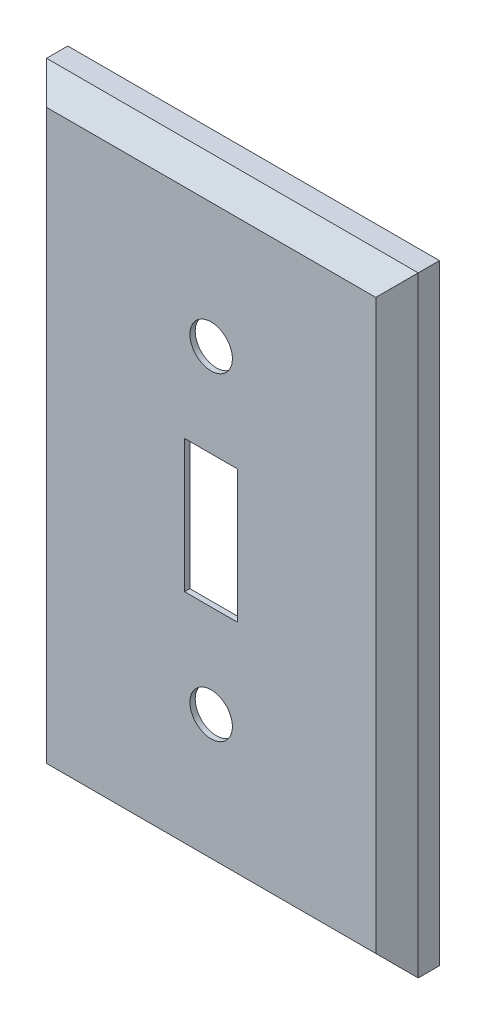
ISO-10303-21;
HEADER;
FILE_DESCRIPTION(('STEP AP214'),'2;1');
FILE_NAME('part.step','',(''),(''),'','','');
FILE_SCHEMA(('AUTOMOTIVE_DESIGN { 1 0 10303 214 1 1 1 1 }'));
ENDSEC;
DATA;
#1=APPLICATION_CONTEXT('core data for automotive mechanical design processes');
#2=APPLICATION_PROTOCOL_DEFINITION('international standard','automotive_design',2000,#1);
#3=PRODUCT_CONTEXT('',#1,'mechanical');
#4=PRODUCT('Part','Part','',(#3));
#5=PRODUCT_RELATED_PRODUCT_CATEGORY('part','',(#4));
#6=PRODUCT_DEFINITION_FORMATION('','',#4);
#7=PRODUCT_DEFINITION_CONTEXT('part definition',#1,'design');
#8=PRODUCT_DEFINITION('design','',#6,#7);
#9=PRODUCT_DEFINITION_SHAPE('','',#8);
#10=(LENGTH_UNIT() NAMED_UNIT(*) SI_UNIT(.MILLI.,.METRE.));
#11=(NAMED_UNIT(*) PLANE_ANGLE_UNIT() SI_UNIT($,.RADIAN.));
#12=(NAMED_UNIT(*) SI_UNIT($,.STERADIAN.) SOLID_ANGLE_UNIT());
#13=UNCERTAINTY_MEASURE_WITH_UNIT(LENGTH_MEASURE(1.E-05),#10,'distance_accuracy_value','');
#14=(GEOMETRIC_REPRESENTATION_CONTEXT(3) GLOBAL_UNCERTAINTY_ASSIGNED_CONTEXT((#13)) GLOBAL_UNIT_ASSIGNED_CONTEXT((#10,
#11,#12)) REPRESENTATION_CONTEXT('',''));
#15=CARTESIAN_POINT('',(0.,0.,0.));
#16=DIRECTION('',(0.,0.,1.));
#17=DIRECTION('',(1.,0.,0.));
#18=AXIS2_PLACEMENT_3D('',#15,#16,#17);
#19=CARTESIAN_POINT('',(0.,0.,0.));
#20=DIRECTION('',(0.,0.,-1.));
#21=DIRECTION('',(-1.,0.,0.));
#22=AXIS2_PLACEMENT_3D('',#19,#20,#21);
#23=PLANE('',#22);
#24=DIRECTION('',(0.,1.,0.));
#25=VECTOR('',#24,1.);
#26=CARTESIAN_POINT('',(35.,-57.5,0.));
#27=LINE('',#26,#25);
#28=CARTESIAN_POINT('',(35.,-57.5,0.));
#29=VERTEX_POINT('',#28);
#30=CARTESIAN_POINT('',(35.,57.5,0.));
#31=VERTEX_POINT('',#30);
#32=EDGE_CURVE('E227',#29,#31,#27,.T.);
#33=ORIENTED_EDGE('',*,*,#32,.F.);
#34=DIRECTION('',(1.,0.,0.));
#35=VECTOR('',#34,1.);
#36=CARTESIAN_POINT('',(-35.,-57.5,0.));
#37=LINE('',#36,#35);
#38=CARTESIAN_POINT('',(-35.,-57.5,0.));
#39=VERTEX_POINT('',#38);
#40=EDGE_CURVE('E237',#39,#29,#37,.T.);
#41=ORIENTED_EDGE('',*,*,#40,.F.);
#42=DIRECTION('',(0.,-1.,0.));
#43=VECTOR('',#42,1.);
#44=CARTESIAN_POINT('',(-35.,-57.5,0.));
#45=LINE('',#44,#43);
#46=CARTESIAN_POINT('',(-35.,57.5,0.));
#47=VERTEX_POINT('',#46);
#48=EDGE_CURVE('E234',#47,#39,#45,.T.);
#49=ORIENTED_EDGE('',*,*,#48,.F.);
#50=DIRECTION('',(-1.,0.,0.));
#51=VECTOR('',#50,1.);
#52=CARTESIAN_POINT('',(-35.,57.5,0.));
#53=LINE('',#52,#51);
#54=EDGE_CURVE('E230',#31,#47,#53,.T.);
#55=ORIENTED_EDGE('',*,*,#54,.F.);
#56=EDGE_LOOP('',(#33,#41,#49,#55));
#57=FACE_BOUND('',#56,.T.);
#58=DIRECTION('',(1.,0.,0.));
#59=VECTOR('',#58,1.);
#60=CARTESIAN_POINT('',(0.,-56.5,0.));
#61=LINE('',#60,#59);
#62=CARTESIAN_POINT('',(-34.,-56.5,0.));
#63=VERTEX_POINT('',#62);
#64=CARTESIAN_POINT('',(34.,-56.5,0.));
#65=VERTEX_POINT('',#64);
#66=EDGE_CURVE('E188',#63,#65,#61,.T.);
#67=ORIENTED_EDGE('',*,*,#66,.T.);
#68=DIRECTION('',(0.,1.,0.));
#69=VECTOR('',#68,1.);
#70=CARTESIAN_POINT('',(34.,0.,0.));
#71=LINE('',#70,#69);
#72=CARTESIAN_POINT('',(34.,56.5,0.));
#73=VERTEX_POINT('',#72);
#74=EDGE_CURVE('E202',#65,#73,#71,.T.);
#75=ORIENTED_EDGE('',*,*,#74,.T.);
#76=DIRECTION('',(-1.,0.,0.));
#77=VECTOR('',#76,1.);
#78=CARTESIAN_POINT('',(0.,56.5,0.));
#79=LINE('',#78,#77);
#80=CARTESIAN_POINT('',(-34.,56.5,0.));
#81=VERTEX_POINT('',#80);
#82=EDGE_CURVE('E219',#73,#81,#79,.T.);
#83=ORIENTED_EDGE('',*,*,#82,.T.);
#84=DIRECTION('',(0.,-1.,0.));
#85=VECTOR('',#84,1.);
#86=CARTESIAN_POINT('',(-34.,0.,0.));
#87=LINE('',#86,#85);
#88=EDGE_CURVE('E222',#81,#63,#87,.T.);
#89=ORIENTED_EDGE('',*,*,#88,.T.);
#90=EDGE_LOOP('',(#67,#75,#83,#89));
#91=FACE_BOUND('',#90,.T.);
#92=ADVANCED_FACE('F34',(#57,#91),#23,.T.);
#93=CARTESIAN_POINT('',(35.,-57.5,8.));
#94=DIRECTION('',(-1.,0.,0.));
#95=DIRECTION('',(0.,0.,1.));
#96=AXIS2_PLACEMENT_3D('',#93,#94,#95);
#97=PLANE('',#96);
#98=DIRECTION('',(0.,0.,-1.));
#99=VECTOR('',#98,1.);
#100=CARTESIAN_POINT('',(35.,57.5,8.));
#101=LINE('',#100,#99);
#102=CARTESIAN_POINT('',(35.,57.5,3.99999999999998));
#103=VERTEX_POINT('',#102);
#104=EDGE_CURVE('E246',#103,#31,#101,.T.);
#105=ORIENTED_EDGE('',*,*,#104,.F.);
#106=DIRECTION('',(0.,-1.,0.));
#107=VECTOR('',#106,1.);
#108=CARTESIAN_POINT('',(35.,-57.5,3.99999999999998));
#109=LINE('',#108,#107);
#110=CARTESIAN_POINT('',(35.,-57.5,3.99999999999998));
#111=VERTEX_POINT('',#110);
#112=EDGE_CURVE('E264',#103,#111,#109,.T.);
#113=ORIENTED_EDGE('',*,*,#112,.T.);
#114=DIRECTION('',(0.,0.,-1.));
#115=VECTOR('',#114,1.);
#116=CARTESIAN_POINT('',(35.,-57.5,8.));
#117=LINE('',#116,#115);
#118=EDGE_CURVE('E240',#111,#29,#117,.T.);
#119=ORIENTED_EDGE('',*,*,#118,.T.);
#120=ORIENTED_EDGE('',*,*,#32,.T.);
#121=EDGE_LOOP('',(#105,#113,#119,#120));
#122=FACE_BOUND('',#121,.T.);
#123=ADVANCED_FACE('F331',(#122),#97,.F.);
#124=CARTESIAN_POINT('',(-35.,57.5,8.));
#125=DIRECTION('',(0.,-1.,0.));
#126=DIRECTION('',(0.,0.,-1.));
#127=AXIS2_PLACEMENT_3D('',#124,#125,#126);
#128=PLANE('',#127);
#129=DIRECTION('',(0.,0.,-1.));
#130=VECTOR('',#129,1.);
#131=CARTESIAN_POINT('',(-35.,57.5,8.));
#132=LINE('',#131,#130);
#133=CARTESIAN_POINT('',(-35.,57.5,3.99999999999998));
#134=VERTEX_POINT('',#133);
#135=EDGE_CURVE('E244',#134,#47,#132,.T.);
#136=ORIENTED_EDGE('',*,*,#135,.F.);
#137=DIRECTION('',(1.,0.,0.));
#138=VECTOR('',#137,1.);
#139=CARTESIAN_POINT('',(-35.,57.5,3.99999999999998));
#140=LINE('',#139,#138);
#141=EDGE_CURVE('E262',#134,#103,#140,.T.);
#142=ORIENTED_EDGE('',*,*,#141,.T.);
#143=ORIENTED_EDGE('',*,*,#104,.T.);
#144=ORIENTED_EDGE('',*,*,#54,.T.);
#145=EDGE_LOOP('',(#136,#142,#143,#144));
#146=FACE_BOUND('',#145,.T.);
#147=ADVANCED_FACE('F337',(#146),#128,.F.);
#148=CARTESIAN_POINT('',(-35.,-57.5,8.));
#149=DIRECTION('',(1.,0.,0.));
#150=DIRECTION('',(0.,0.,-1.));
#151=AXIS2_PLACEMENT_3D('',#148,#149,#150);
#152=PLANE('',#151);
#153=DIRECTION('',(0.,0.,-1.));
#154=VECTOR('',#153,1.);
#155=CARTESIAN_POINT('',(-35.,-57.5,8.));
#156=LINE('',#155,#154);
#157=CARTESIAN_POINT('',(-35.,-57.5,3.99999999999998));
#158=VERTEX_POINT('',#157);
#159=EDGE_CURVE('E242',#158,#39,#156,.T.);
#160=ORIENTED_EDGE('',*,*,#159,.F.);
#161=DIRECTION('',(0.,1.,0.));
#162=VECTOR('',#161,1.);
#163=CARTESIAN_POINT('',(-35.,-57.5,3.99999999999998));
#164=LINE('',#163,#162);
#165=EDGE_CURVE('E260',#158,#134,#164,.T.);
#166=ORIENTED_EDGE('',*,*,#165,.T.);
#167=ORIENTED_EDGE('',*,*,#135,.T.);
#168=ORIENTED_EDGE('',*,*,#48,.T.);
#169=EDGE_LOOP('',(#160,#166,#167,#168));
#170=FACE_BOUND('',#169,.T.);
#171=ADVANCED_FACE('F347',(#170),#152,.F.);
#172=CARTESIAN_POINT('',(-35.,-57.5,8.));
#173=DIRECTION('',(0.,1.,0.));
#174=DIRECTION('',(0.,0.,1.));
#175=AXIS2_PLACEMENT_3D('',#172,#173,#174);
#176=PLANE('',#175);
#177=ORIENTED_EDGE('',*,*,#118,.F.);
#178=DIRECTION('',(-1.,0.,0.));
#179=VECTOR('',#178,1.);
#180=CARTESIAN_POINT('',(-35.,-57.5,3.99999999999998));
#181=LINE('',#180,#179);
#182=EDGE_CURVE('E257',#111,#158,#181,.T.);
#183=ORIENTED_EDGE('',*,*,#182,.T.);
#184=ORIENTED_EDGE('',*,*,#159,.T.);
#185=ORIENTED_EDGE('',*,*,#40,.T.);
#186=EDGE_LOOP('',(#177,#183,#184,#185));
#187=FACE_BOUND('',#186,.T.);
#188=ADVANCED_FACE('F344',(#187),#176,.F.);
#189=CARTESIAN_POINT('',(0.,0.,8.));
#190=DIRECTION('',(0.,0.,-1.));
#191=DIRECTION('',(-1.,0.,0.));
#192=AXIS2_PLACEMENT_3D('',#189,#190,#191);
#193=PLANE('',#192);
#194=CARTESIAN_POINT('',(0.,-30.,8.));
#195=DIRECTION('',(0.,0.,1.));
#196=DIRECTION('',(1.,0.,0.));
#197=AXIS2_PLACEMENT_3D('',#194,#195,#196);
#198=CIRCLE('',#197,4.);
#199=CARTESIAN_POINT('',(4.,-30.,8.));
#200=VERTEX_POINT('',#199);
#201=EDGE_CURVE('E395',#200,#200,#198,.T.);
#202=ORIENTED_EDGE('',*,*,#201,.F.);
#203=EDGE_LOOP('',(#202));
#204=FACE_BOUND('',#203,.T.);
#205=CARTESIAN_POINT('',(0.,30.,8.));
#206=DIRECTION('',(0.,0.,1.));
#207=DIRECTION('',(1.,0.,0.));
#208=AXIS2_PLACEMENT_3D('',#205,#206,#207);
#209=CIRCLE('',#208,4.);
#210=CARTESIAN_POINT('',(4.,30.,8.));
#211=VERTEX_POINT('',#210);
#212=EDGE_CURVE('E398',#211,#211,#209,.T.);
#213=ORIENTED_EDGE('',*,*,#212,.F.);
#214=EDGE_LOOP('',(#213));
#215=FACE_BOUND('',#214,.T.);
#216=DIRECTION('',(-1.,0.,0.));
#217=VECTOR('',#216,1.);
#218=CARTESIAN_POINT('',(-5.,12.5,8.));
#219=LINE('',#218,#217);
#220=CARTESIAN_POINT('',(5.,12.5,8.));
#221=VERTEX_POINT('',#220);
#222=CARTESIAN_POINT('',(-5.,12.5,8.));
#223=VERTEX_POINT('',#222);
#224=EDGE_CURVE('E160',#221,#223,#219,.T.);
#225=ORIENTED_EDGE('',*,*,#224,.F.);
#226=DIRECTION('',(0.,1.,0.));
#227=VECTOR('',#226,1.);
#228=CARTESIAN_POINT('',(5.,-12.5,8.));
#229=LINE('',#228,#227);
#230=CARTESIAN_POINT('',(5.,-12.5,8.));
#231=VERTEX_POINT('',#230);
#232=EDGE_CURVE('E51',#231,#221,#229,.T.);
#233=ORIENTED_EDGE('',*,*,#232,.F.);
#234=DIRECTION('',(1.,0.,0.));
#235=VECTOR('',#234,1.);
#236=CARTESIAN_POINT('',(-5.,-12.5,8.));
#237=LINE('',#236,#235);
#238=CARTESIAN_POINT('',(-5.,-12.5,8.));
#239=VERTEX_POINT('',#238);
#240=EDGE_CURVE('E167',#239,#231,#237,.T.);
#241=ORIENTED_EDGE('',*,*,#240,.F.);
#242=DIRECTION('',(0.,-1.,0.));
#243=VECTOR('',#242,1.);
#244=CARTESIAN_POINT('',(-5.,-12.5,8.));
#245=LINE('',#244,#243);
#246=EDGE_CURVE('E151',#223,#239,#245,.T.);
#247=ORIENTED_EDGE('',*,*,#246,.F.);
#248=EDGE_LOOP('',(#225,#233,#241,#247));
#249=FACE_BOUND('',#248,.T.);
#250=DIRECTION('',(0.,-1.,0.));
#251=VECTOR('',#250,1.);
#252=CARTESIAN_POINT('',(-31.,0.,8.));
#253=LINE('',#252,#251);
#254=CARTESIAN_POINT('',(-31.,53.5,8.));
#255=VERTEX_POINT('',#254);
#256=CARTESIAN_POINT('',(-31.,-53.5,8.));
#257=VERTEX_POINT('',#256);
#258=EDGE_CURVE('E252',#255,#257,#253,.T.);
#259=ORIENTED_EDGE('',*,*,#258,.T.);
#260=DIRECTION('',(1.,0.,0.));
#261=VECTOR('',#260,1.);
#262=CARTESIAN_POINT('',(0.,-53.5,8.));
#263=LINE('',#262,#261);
#264=CARTESIAN_POINT('',(31.,-53.5,8.));
#265=VERTEX_POINT('',#264);
#266=EDGE_CURVE('E254',#257,#265,#263,.T.);
#267=ORIENTED_EDGE('',*,*,#266,.T.);
#268=DIRECTION('',(0.,1.,0.));
#269=VECTOR('',#268,1.);
#270=CARTESIAN_POINT('',(31.,0.,8.));
#271=LINE('',#270,#269);
#272=CARTESIAN_POINT('',(31.,53.5,8.));
#273=VERTEX_POINT('',#272);
#274=EDGE_CURVE('E248',#265,#273,#271,.T.);
#275=ORIENTED_EDGE('',*,*,#274,.T.);
#276=DIRECTION('',(-1.,0.,0.));
#277=VECTOR('',#276,1.);
#278=CARTESIAN_POINT('',(0.,53.5,8.));
#279=LINE('',#278,#277);
#280=EDGE_CURVE('E250',#273,#255,#279,.T.);
#281=ORIENTED_EDGE('',*,*,#280,.T.);
#282=EDGE_LOOP('',(#259,#267,#275,#281));
#283=FACE_BOUND('',#282,.T.);
#284=ADVANCED_FACE('F164',(#204,#215,#249,#283),#193,.F.);
#285=CARTESIAN_POINT('',(0.,53.5,8.));
#286=DIRECTION('',(0.,-0.707106781186549,-0.707106781186546));
#287=DIRECTION('',(-1.,0.,0.));
#288=AXIS2_PLACEMENT_3D('',#285,#286,#287);
#289=PLANE('',#288);
#290=DIRECTION('',(-0.577350269189625,-0.577350269189625,0.577350269189627));
#291=VECTOR('',#290,1.);
#292=CARTESIAN_POINT('',(13.1666666666667,35.6666666666667,25.8333333333334));
#293=LINE('',#292,#291);
#294=EDGE_CURVE('E270',#103,#273,#293,.T.);
#295=ORIENTED_EDGE('',*,*,#294,.F.);
#296=ORIENTED_EDGE('',*,*,#141,.F.);
#297=DIRECTION('',(0.577350269189625,-0.577350269189625,0.577350269189627));
#298=VECTOR('',#297,1.);
#299=CARTESIAN_POINT('',(-20.6666666666667,43.1666666666667,18.3333333333333));
#300=LINE('',#299,#298);
#301=EDGE_CURVE('E231',#255,#134,#300,.F.);
#302=ORIENTED_EDGE('',*,*,#301,.F.);
#303=ORIENTED_EDGE('',*,*,#280,.F.);
#304=EDGE_LOOP('',(#295,#296,#302,#303));
#305=FACE_BOUND('',#304,.T.);
#306=ADVANCED_FACE('F36',(#305),#289,.F.);
#307=CARTESIAN_POINT('',(-31.,0.,8.));
#308=DIRECTION('',(0.707106781186549,0.,-0.707106781186546));
#309=DIRECTION('',(0.,-1.,0.));
#310=AXIS2_PLACEMENT_3D('',#307,#308,#309);
#311=PLANE('',#310);
#312=ORIENTED_EDGE('',*,*,#301,.T.);
#313=ORIENTED_EDGE('',*,*,#165,.F.);
#314=DIRECTION('',(0.577350269189625,0.577350269189625,0.577350269189627));
#315=VECTOR('',#314,1.);
#316=CARTESIAN_POINT('',(-13.1666666666667,-35.6666666666667,25.8333333333333));
#317=LINE('',#316,#315);
#318=EDGE_CURVE('E268',#257,#158,#317,.F.);
#319=ORIENTED_EDGE('',*,*,#318,.F.);
#320=ORIENTED_EDGE('',*,*,#258,.F.);
#321=EDGE_LOOP('',(#312,#313,#319,#320));
#322=FACE_BOUND('',#321,.T.);
#323=ADVANCED_FACE('F361',(#322),#311,.F.);
#324=CARTESIAN_POINT('',(31.,0.,8.));
#325=DIRECTION('',(-0.707106781186549,0.,-0.707106781186546));
#326=DIRECTION('',(0.,1.,0.));
#327=AXIS2_PLACEMENT_3D('',#324,#325,#326);
#328=PLANE('',#327);
#329=ORIENTED_EDGE('',*,*,#294,.T.);
#330=ORIENTED_EDGE('',*,*,#274,.F.);
#331=DIRECTION('',(0.577350269189625,-0.577350269189625,-0.577350269189627));
#332=VECTOR('',#331,1.);
#333=CARTESIAN_POINT('',(13.1666666666667,-35.6666666666667,25.8333333333333));
#334=LINE('',#333,#332);
#335=EDGE_CURVE('E183',#111,#265,#334,.F.);
#336=ORIENTED_EDGE('',*,*,#335,.F.);
#337=ORIENTED_EDGE('',*,*,#112,.F.);
#338=EDGE_LOOP('',(#329,#330,#336,#337));
#339=FACE_BOUND('',#338,.T.);
#340=ADVANCED_FACE('F358',(#339),#328,.F.);
#341=CARTESIAN_POINT('',(0.,-53.5,8.));
#342=DIRECTION('',(0.,0.707106781186549,-0.707106781186546));
#343=DIRECTION('',(1.,0.,0.));
#344=AXIS2_PLACEMENT_3D('',#341,#342,#343);
#345=PLANE('',#344);
#346=ORIENTED_EDGE('',*,*,#318,.T.);
#347=ORIENTED_EDGE('',*,*,#182,.F.);
#348=ORIENTED_EDGE('',*,*,#335,.T.);
#349=ORIENTED_EDGE('',*,*,#266,.F.);
#350=EDGE_LOOP('',(#346,#347,#348,#349));
#351=FACE_BOUND('',#350,.T.);
#352=ADVANCED_FACE('F355',(#351),#345,.F.);
#353=CARTESIAN_POINT('',(34.,-57.5,8.));
#354=DIRECTION('',(-1.,0.,0.));
#355=DIRECTION('',(0.,0.,1.));
#356=AXIS2_PLACEMENT_3D('',#353,#354,#355);
#357=PLANE('',#356);
#358=DIRECTION('',(0.,0.,-1.));
#359=VECTOR('',#358,1.);
#360=CARTESIAN_POINT('',(34.,56.5,8.));
#361=LINE('',#360,#359);
#362=CARTESIAN_POINT('',(34.,56.5,3.58578643762689));
#363=VERTEX_POINT('',#362);
#364=EDGE_CURVE('E177',#363,#73,#361,.T.);
#365=ORIENTED_EDGE('',*,*,#364,.T.);
#366=ORIENTED_EDGE('',*,*,#74,.F.);
#367=DIRECTION('',(0.,0.,-1.));
#368=VECTOR('',#367,1.);
#369=CARTESIAN_POINT('',(34.,-56.5,8.));
#370=LINE('',#369,#368);
#371=CARTESIAN_POINT('',(34.,-56.5,3.58578643762689));
#372=VERTEX_POINT('',#371);
#373=EDGE_CURVE('E185',#372,#65,#370,.T.);
#374=ORIENTED_EDGE('',*,*,#373,.F.);
#375=DIRECTION('',(0.,1.,0.));
#376=VECTOR('',#375,1.);
#377=CARTESIAN_POINT('',(34.,0.,3.58578643762689));
#378=LINE('',#377,#376);
#379=EDGE_CURVE('E181',#363,#372,#378,.F.);
#380=ORIENTED_EDGE('',*,*,#379,.F.);
#381=EDGE_LOOP('',(#365,#366,#374,#380));
#382=FACE_BOUND('',#381,.T.);
#383=ADVANCED_FACE('F327',(#382),#357,.T.);
#384=CARTESIAN_POINT('',(-35.,56.5,8.));
#385=DIRECTION('',(0.,-1.,0.));
#386=DIRECTION('',(0.,0.,-1.));
#387=AXIS2_PLACEMENT_3D('',#384,#385,#386);
#388=PLANE('',#387);
#389=DIRECTION('',(0.,0.,-1.));
#390=VECTOR('',#389,1.);
#391=CARTESIAN_POINT('',(-34.,56.5,8.));
#392=LINE('',#391,#390);
#393=CARTESIAN_POINT('',(-34.,56.5,3.58578643762689));
#394=VERTEX_POINT('',#393);
#395=EDGE_CURVE('E180',#394,#81,#392,.T.);
#396=ORIENTED_EDGE('',*,*,#395,.T.);
#397=ORIENTED_EDGE('',*,*,#82,.F.);
#398=ORIENTED_EDGE('',*,*,#364,.F.);
#399=DIRECTION('',(-1.,0.,0.));
#400=VECTOR('',#399,1.);
#401=CARTESIAN_POINT('',(0.,56.5,3.58578643762689));
#402=LINE('',#401,#400);
#403=EDGE_CURVE('E184',#394,#363,#402,.F.);
#404=ORIENTED_EDGE('',*,*,#403,.F.);
#405=EDGE_LOOP('',(#396,#397,#398,#404));
#406=FACE_BOUND('',#405,.T.);
#407=ADVANCED_FACE('F319',(#406),#388,.T.);
#408=CARTESIAN_POINT('',(-34.,-57.5,8.));
#409=DIRECTION('',(1.,0.,0.));
#410=DIRECTION('',(0.,0.,-1.));
#411=AXIS2_PLACEMENT_3D('',#408,#409,#410);
#412=PLANE('',#411);
#413=DIRECTION('',(0.,0.,-1.));
#414=VECTOR('',#413,1.);
#415=CARTESIAN_POINT('',(-34.,-56.5,8.));
#416=LINE('',#415,#414);
#417=CARTESIAN_POINT('',(-34.,-56.5,3.58578643762689));
#418=VERTEX_POINT('',#417);
#419=EDGE_CURVE('E187',#418,#63,#416,.T.);
#420=ORIENTED_EDGE('',*,*,#419,.T.);
#421=ORIENTED_EDGE('',*,*,#88,.F.);
#422=ORIENTED_EDGE('',*,*,#395,.F.);
#423=DIRECTION('',(0.,-1.,0.));
#424=VECTOR('',#423,1.);
#425=CARTESIAN_POINT('',(-34.,0.,3.58578643762689));
#426=LINE('',#425,#424);
#427=EDGE_CURVE('E192',#418,#394,#426,.F.);
#428=ORIENTED_EDGE('',*,*,#427,.F.);
#429=EDGE_LOOP('',(#420,#421,#422,#428));
#430=FACE_BOUND('',#429,.T.);
#431=ADVANCED_FACE('F313',(#430),#412,.T.);
#432=CARTESIAN_POINT('',(-35.,-56.5,8.));
#433=DIRECTION('',(0.,1.,0.));
#434=DIRECTION('',(0.,0.,1.));
#435=AXIS2_PLACEMENT_3D('',#432,#433,#434);
#436=PLANE('',#435);
#437=ORIENTED_EDGE('',*,*,#373,.T.);
#438=ORIENTED_EDGE('',*,*,#66,.F.);
#439=ORIENTED_EDGE('',*,*,#419,.F.);
#440=DIRECTION('',(1.,0.,0.));
#441=VECTOR('',#440,1.);
#442=CARTESIAN_POINT('',(0.,-56.5,3.58578643762689));
#443=LINE('',#442,#441);
#444=EDGE_CURVE('E195',#372,#418,#443,.F.);
#445=ORIENTED_EDGE('',*,*,#444,.F.);
#446=EDGE_LOOP('',(#437,#438,#439,#445));
#447=FACE_BOUND('',#446,.T.);
#448=ADVANCED_FACE('F290',(#447),#436,.T.);
#449=CARTESIAN_POINT('',(0.,0.,7.));
#450=DIRECTION('',(0.,0.,-1.));
#451=DIRECTION('',(-1.,0.,0.));
#452=AXIS2_PLACEMENT_3D('',#449,#450,#451);
#453=PLANE('',#452);
#454=CARTESIAN_POINT('',(0.,-30.,7.));
#455=DIRECTION('',(0.,0.,-1.));
#456=DIRECTION('',(-1.,0.,0.));
#457=AXIS2_PLACEMENT_3D('',#454,#455,#456);
#458=CIRCLE('',#457,4.);
#459=CARTESIAN_POINT('',(-4.,-30.,7.));
#460=VERTEX_POINT('',#459);
#461=EDGE_CURVE('E38',#460,#460,#458,.T.);
#462=ORIENTED_EDGE('',*,*,#461,.F.);
#463=EDGE_LOOP('',(#462));
#464=FACE_BOUND('',#463,.T.);
#465=CARTESIAN_POINT('',(0.,30.,7.));
#466=DIRECTION('',(0.,0.,-1.));
#467=DIRECTION('',(-1.,0.,0.));
#468=AXIS2_PLACEMENT_3D('',#465,#466,#467);
#469=CIRCLE('',#468,4.);
#470=CARTESIAN_POINT('',(-4.,30.,7.));
#471=VERTEX_POINT('',#470);
#472=EDGE_CURVE('E174',#471,#471,#469,.T.);
#473=ORIENTED_EDGE('',*,*,#472,.F.);
#474=EDGE_LOOP('',(#473));
#475=FACE_BOUND('',#474,.T.);
#476=DIRECTION('',(0.,-1.,0.));
#477=VECTOR('',#476,1.);
#478=CARTESIAN_POINT('',(5.,0.,7.));
#479=LINE('',#478,#477);
#480=CARTESIAN_POINT('',(5.,12.5,7.));
#481=VERTEX_POINT('',#480);
#482=CARTESIAN_POINT('',(5.,-12.5,7.));
#483=VERTEX_POINT('',#482);
#484=EDGE_CURVE('E11',#481,#483,#479,.T.);
#485=ORIENTED_EDGE('',*,*,#484,.F.);
#486=DIRECTION('',(1.,0.,0.));
#487=VECTOR('',#486,1.);
#488=CARTESIAN_POINT('',(0.,12.5,7.));
#489=LINE('',#488,#487);
#490=CARTESIAN_POINT('',(-5.,12.5,7.));
#491=VERTEX_POINT('',#490);
#492=EDGE_CURVE('E266',#491,#481,#489,.T.);
#493=ORIENTED_EDGE('',*,*,#492,.F.);
#494=DIRECTION('',(0.,1.,0.));
#495=VECTOR('',#494,1.);
#496=CARTESIAN_POINT('',(-5.,0.,7.));
#497=LINE('',#496,#495);
#498=CARTESIAN_POINT('',(-5.,-12.5,7.));
#499=VERTEX_POINT('',#498);
#500=EDGE_CURVE('E154',#499,#491,#497,.T.);
#501=ORIENTED_EDGE('',*,*,#500,.F.);
#502=DIRECTION('',(-1.,0.,0.));
#503=VECTOR('',#502,1.);
#504=CARTESIAN_POINT('',(0.,-12.5,7.));
#505=LINE('',#504,#503);
#506=EDGE_CURVE('E43',#483,#499,#505,.T.);
#507=ORIENTED_EDGE('',*,*,#506,.F.);
#508=EDGE_LOOP('',(#485,#493,#501,#507));
#509=FACE_BOUND('',#508,.T.);
#510=DIRECTION('',(0.,1.,0.));
#511=VECTOR('',#510,1.);
#512=CARTESIAN_POINT('',(-30.5857864376269,0.,7.));
#513=LINE('',#512,#511);
#514=CARTESIAN_POINT('',(-30.5857864376269,53.0857864376269,7.));
#515=VERTEX_POINT('',#514);
#516=CARTESIAN_POINT('',(-30.5857864376269,-53.0857864376269,7.));
#517=VERTEX_POINT('',#516);
#518=EDGE_CURVE('E207',#515,#517,#513,.F.);
#519=ORIENTED_EDGE('',*,*,#518,.F.);
#520=DIRECTION('',(1.,0.,0.));
#521=VECTOR('',#520,1.);
#522=CARTESIAN_POINT('',(0.,53.0857864376269,7.));
#523=LINE('',#522,#521);
#524=CARTESIAN_POINT('',(30.5857864376269,53.0857864376269,7.));
#525=VERTEX_POINT('',#524);
#526=EDGE_CURVE('E209',#525,#515,#523,.F.);
#527=ORIENTED_EDGE('',*,*,#526,.F.);
#528=DIRECTION('',(0.,-1.,0.));
#529=VECTOR('',#528,1.);
#530=CARTESIAN_POINT('',(30.5857864376269,0.,7.));
#531=LINE('',#530,#529);
#532=CARTESIAN_POINT('',(30.5857864376269,-53.0857864376269,7.));
#533=VERTEX_POINT('',#532);
#534=EDGE_CURVE('E179',#533,#525,#531,.F.);
#535=ORIENTED_EDGE('',*,*,#534,.F.);
#536=DIRECTION('',(-1.,0.,0.));
#537=VECTOR('',#536,1.);
#538=CARTESIAN_POINT('',(0.,-53.0857864376269,7.));
#539=LINE('',#538,#537);
#540=EDGE_CURVE('E198',#517,#533,#539,.F.);
#541=ORIENTED_EDGE('',*,*,#540,.F.);
#542=EDGE_LOOP('',(#519,#527,#535,#541));
#543=FACE_BOUND('',#542,.T.);
#544=ADVANCED_FACE('F286',(#464,#475,#509,#543),#453,.T.);
#545=CARTESIAN_POINT('',(0.,52.7928932188135,7.29289321881345));
#546=DIRECTION('',(0.,-0.707106781186549,-0.707106781186546));
#547=DIRECTION('',(-1.,0.,0.));
#548=AXIS2_PLACEMENT_3D('',#545,#546,#547);
#549=PLANE('',#548);
#550=DIRECTION('',(-0.577350269189625,-0.577350269189625,0.577350269189627));
#551=VECTOR('',#550,1.);
#552=CARTESIAN_POINT('',(12.6952621458757,35.1952621458757,24.8905242917513));
#553=LINE('',#552,#551);
#554=EDGE_CURVE('E203',#363,#525,#553,.T.);
#555=ORIENTED_EDGE('',*,*,#554,.T.);
#556=ORIENTED_EDGE('',*,*,#526,.T.);
#557=DIRECTION('',(-0.577350269189625,0.577350269189625,-0.577350269189627));
#558=VECTOR('',#557,1.);
#559=CARTESIAN_POINT('',(-12.6952621458757,35.1952621458757,24.8905242917513));
#560=LINE('',#559,#558);
#561=EDGE_CURVE('E199',#515,#394,#560,.T.);
#562=ORIENTED_EDGE('',*,*,#561,.T.);
#563=ORIENTED_EDGE('',*,*,#403,.T.);
#564=EDGE_LOOP('',(#555,#556,#562,#563));
#565=FACE_BOUND('',#564,.T.);
#566=ADVANCED_FACE('F289',(#565),#549,.T.);
#567=CARTESIAN_POINT('',(-30.2928932188134,0.,7.29289321881345));
#568=DIRECTION('',(0.707106781186549,0.,-0.707106781186546));
#569=DIRECTION('',(0.,-1.,0.));
#570=AXIS2_PLACEMENT_3D('',#567,#568,#569);
#571=PLANE('',#570);
#572=ORIENTED_EDGE('',*,*,#561,.F.);
#573=ORIENTED_EDGE('',*,*,#518,.T.);
#574=DIRECTION('',(-0.577350269189625,-0.577350269189625,-0.577350269189627));
#575=VECTOR('',#574,1.);
#576=CARTESIAN_POINT('',(-20.1952621458756,-42.6952621458757,17.3905242917513));
#577=LINE('',#576,#575);
#578=EDGE_CURVE('E204',#517,#418,#577,.T.);
#579=ORIENTED_EDGE('',*,*,#578,.T.);
#580=ORIENTED_EDGE('',*,*,#427,.T.);
#581=EDGE_LOOP('',(#572,#573,#579,#580));
#582=FACE_BOUND('',#581,.T.);
#583=ADVANCED_FACE('F303',(#582),#571,.T.);
#584=CARTESIAN_POINT('',(30.2928932188135,0.,7.29289321881345));
#585=DIRECTION('',(-0.707106781186549,0.,-0.707106781186546));
#586=DIRECTION('',(0.,1.,0.));
#587=AXIS2_PLACEMENT_3D('',#584,#585,#586);
#588=PLANE('',#587);
#589=ORIENTED_EDGE('',*,*,#554,.F.);
#590=ORIENTED_EDGE('',*,*,#379,.T.);
#591=DIRECTION('',(-0.577350269189625,0.577350269189625,0.577350269189627));
#592=VECTOR('',#591,1.);
#593=CARTESIAN_POINT('',(20.1952621458757,-42.6952621458756,17.3905242917513));
#594=LINE('',#593,#592);
#595=EDGE_CURVE('E206',#372,#533,#594,.T.);
#596=ORIENTED_EDGE('',*,*,#595,.T.);
#597=ORIENTED_EDGE('',*,*,#534,.T.);
#598=EDGE_LOOP('',(#589,#590,#596,#597));
#599=FACE_BOUND('',#598,.T.);
#600=ADVANCED_FACE('F324',(#599),#588,.T.);
#601=CARTESIAN_POINT('',(0.,-52.7928932188134,7.29289321881345));
#602=DIRECTION('',(0.,0.707106781186549,-0.707106781186546));
#603=DIRECTION('',(1.,0.,0.));
#604=AXIS2_PLACEMENT_3D('',#601,#602,#603);
#605=PLANE('',#604);
#606=ORIENTED_EDGE('',*,*,#578,.F.);
#607=ORIENTED_EDGE('',*,*,#540,.T.);
#608=ORIENTED_EDGE('',*,*,#595,.F.);
#609=ORIENTED_EDGE('',*,*,#444,.T.);
#610=EDGE_LOOP('',(#606,#607,#608,#609));
#611=FACE_BOUND('',#610,.T.);
#612=ADVANCED_FACE('F306',(#611),#605,.T.);
#613=CARTESIAN_POINT('',(5.,-12.5,0.));
#614=DIRECTION('',(1.,0.,0.));
#615=DIRECTION('',(0.,0.,-1.));
#616=AXIS2_PLACEMENT_3D('',#613,#614,#615);
#617=PLANE('',#616);
#618=ORIENTED_EDGE('',*,*,#484,.T.);
#619=DIRECTION('',(0.,0.,1.));
#620=VECTOR('',#619,1.);
#621=CARTESIAN_POINT('',(5.,-12.5,0.));
#622=LINE('',#621,#620);
#623=EDGE_CURVE('E172',#483,#231,#622,.T.);
#624=ORIENTED_EDGE('',*,*,#623,.T.);
#625=ORIENTED_EDGE('',*,*,#232,.T.);
#626=DIRECTION('',(0.,0.,1.));
#627=VECTOR('',#626,1.);
#628=CARTESIAN_POINT('',(5.,12.5,0.));
#629=LINE('',#628,#627);
#630=EDGE_CURVE('E157',#481,#221,#629,.T.);
#631=ORIENTED_EDGE('',*,*,#630,.F.);
#632=EDGE_LOOP('',(#618,#624,#625,#631));
#633=FACE_BOUND('',#632,.T.);
#634=ADVANCED_FACE('F413',(#633),#617,.F.);
#635=CARTESIAN_POINT('',(-5.,-12.5,0.));
#636=DIRECTION('',(0.,-1.,0.));
#637=DIRECTION('',(0.,0.,-1.));
#638=AXIS2_PLACEMENT_3D('',#635,#636,#637);
#639=PLANE('',#638);
#640=ORIENTED_EDGE('',*,*,#506,.T.);
#641=DIRECTION('',(0.,0.,1.));
#642=VECTOR('',#641,1.);
#643=CARTESIAN_POINT('',(-5.,-12.5,0.));
#644=LINE('',#643,#642);
#645=EDGE_CURVE('E156',#499,#239,#644,.T.);
#646=ORIENTED_EDGE('',*,*,#645,.T.);
#647=ORIENTED_EDGE('',*,*,#240,.T.);
#648=ORIENTED_EDGE('',*,*,#623,.F.);
#649=EDGE_LOOP('',(#640,#646,#647,#648));
#650=FACE_BOUND('',#649,.T.);
#651=ADVANCED_FACE('F410',(#650),#639,.F.);
#652=CARTESIAN_POINT('',(-5.,-12.5,0.));
#653=DIRECTION('',(-1.,0.,0.));
#654=DIRECTION('',(0.,0.,1.));
#655=AXIS2_PLACEMENT_3D('',#652,#653,#654);
#656=PLANE('',#655);
#657=ORIENTED_EDGE('',*,*,#500,.T.);
#658=DIRECTION('',(0.,0.,1.));
#659=VECTOR('',#658,1.);
#660=CARTESIAN_POINT('',(-5.,12.5,0.));
#661=LINE('',#660,#659);
#662=EDGE_CURVE('E59',#491,#223,#661,.T.);
#663=ORIENTED_EDGE('',*,*,#662,.T.);
#664=ORIENTED_EDGE('',*,*,#246,.T.);
#665=ORIENTED_EDGE('',*,*,#645,.F.);
#666=EDGE_LOOP('',(#657,#663,#664,#665));
#667=FACE_BOUND('',#666,.T.);
#668=ADVANCED_FACE('F148',(#667),#656,.F.);
#669=CARTESIAN_POINT('',(-5.,12.5,0.));
#670=DIRECTION('',(0.,1.,0.));
#671=DIRECTION('',(0.,0.,1.));
#672=AXIS2_PLACEMENT_3D('',#669,#670,#671);
#673=PLANE('',#672);
#674=ORIENTED_EDGE('',*,*,#492,.T.);
#675=ORIENTED_EDGE('',*,*,#630,.T.);
#676=ORIENTED_EDGE('',*,*,#224,.T.);
#677=ORIENTED_EDGE('',*,*,#662,.F.);
#678=EDGE_LOOP('',(#674,#675,#676,#677));
#679=FACE_BOUND('',#678,.T.);
#680=ADVANCED_FACE('F161',(#679),#673,.F.);
#681=CARTESIAN_POINT('',(0.,30.,0.));
#682=DIRECTION('',(0.,0.,1.));
#683=DIRECTION('',(1.,0.,0.));
#684=AXIS2_PLACEMENT_3D('',#681,#682,#683);
#685=CYLINDRICAL_SURFACE('',#684,4.);
#686=ORIENTED_EDGE('',*,*,#472,.T.);
#687=EDGE_LOOP('',(#686));
#688=FACE_BOUND('',#687,.T.);
#689=ORIENTED_EDGE('',*,*,#212,.T.);
#690=EDGE_LOOP('',(#689));
#691=FACE_BOUND('',#690,.T.);
#692=ADVANCED_FACE('F403',(#688,#691),#685,.F.);
#693=CARTESIAN_POINT('',(0.,-30.,0.));
#694=DIRECTION('',(0.,0.,1.));
#695=DIRECTION('',(1.,0.,0.));
#696=AXIS2_PLACEMENT_3D('',#693,#694,#695);
#697=CYLINDRICAL_SURFACE('',#696,4.);
#698=ORIENTED_EDGE('',*,*,#461,.T.);
#699=EDGE_LOOP('',(#698));
#700=FACE_BOUND('',#699,.T.);
#701=ORIENTED_EDGE('',*,*,#201,.T.);
#702=EDGE_LOOP('',(#701));
#703=FACE_BOUND('',#702,.T.);
#704=ADVANCED_FACE('F283',(#700,#703),#697,.F.);
#705=CLOSED_SHELL('',(#92,#123,#147,#171,#188,#284,#306,#323,#340,#352,#383,#407,#431,#448,#544,
#566,#583,#600,#612,#634,#651,#668,#680,#692,#704));
#706=MANIFOLD_SOLID_BREP('B2',#705);
#707=ADVANCED_BREP_SHAPE_REPRESENTATION('',(#18,#706),#14);
#708=SHAPE_DEFINITION_REPRESENTATION(#9,#707);
ENDSEC;
END-ISO-10303-21;
